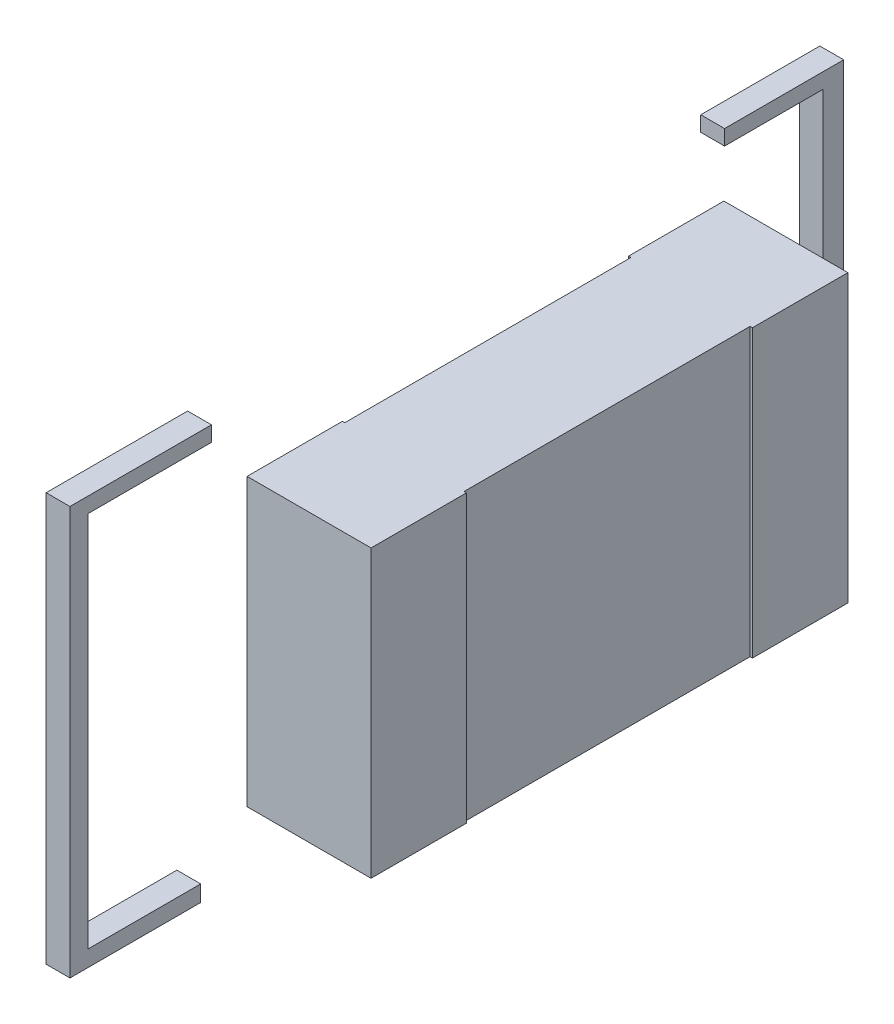
ISO-10303-21;
HEADER;
FILE_DESCRIPTION(('STEP AP214'),'2;1');
FILE_NAME('part.step','',(''),(''),'','','');
FILE_SCHEMA(('AUTOMOTIVE_DESIGN { 1 0 10303 214 1 1 1 1 }'));
ENDSEC;
DATA;
#1=APPLICATION_CONTEXT('core data for automotive mechanical design processes');
#2=APPLICATION_PROTOCOL_DEFINITION('international standard','automotive_design',2000,#1);
#3=PRODUCT_CONTEXT('',#1,'mechanical');
#4=PRODUCT('Part','Part','',(#3));
#5=PRODUCT_RELATED_PRODUCT_CATEGORY('part','',(#4));
#6=PRODUCT_DEFINITION_FORMATION('','',#4);
#7=PRODUCT_DEFINITION_CONTEXT('part definition',#1,'design');
#8=PRODUCT_DEFINITION('design','',#6,#7);
#9=PRODUCT_DEFINITION_SHAPE('','',#8);
#10=(LENGTH_UNIT() NAMED_UNIT(*) SI_UNIT(.MILLI.,.METRE.));
#11=(NAMED_UNIT(*) PLANE_ANGLE_UNIT() SI_UNIT($,.RADIAN.));
#12=(NAMED_UNIT(*) SI_UNIT($,.STERADIAN.) SOLID_ANGLE_UNIT());
#13=UNCERTAINTY_MEASURE_WITH_UNIT(LENGTH_MEASURE(1.E-05),#10,'distance_accuracy_value','');
#14=(GEOMETRIC_REPRESENTATION_CONTEXT(3) GLOBAL_UNCERTAINTY_ASSIGNED_CONTEXT((#13)) GLOBAL_UNIT_ASSIGNED_CONTEXT((#10,
#11,#12)) REPRESENTATION_CONTEXT('',''));
#15=CARTESIAN_POINT('',(0.,0.,0.));
#16=DIRECTION('',(0.,0.,1.));
#17=DIRECTION('',(1.,0.,0.));
#18=AXIS2_PLACEMENT_3D('',#15,#16,#17);
#19=CARTESIAN_POINT('',(-0.11,-1.45076015968424,0.594444727503703));
#20=DIRECTION('',(0.,1.,0.));
#21=DIRECTION('',(-1.,0.,0.));
#22=AXIS2_PLACEMENT_3D('',#19,#20,#21);
#23=PLANE('',#22);
#24=DIRECTION('',(0.,0.,1.));
#25=VECTOR('',#24,1.);
#26=CARTESIAN_POINT('',(-0.00999999999999985,-1.45076015968424,0.594444727503703));
#27=LINE('',#26,#25);
#28=CARTESIAN_POINT('',(-0.00999999999999985,-1.45076015968424,0.594444727503703));
#29=VERTEX_POINT('',#28);
#30=CARTESIAN_POINT('',(-0.00999999999999985,-1.45076015968424,1.14283758981673));
#31=VERTEX_POINT('',#30);
#32=EDGE_CURVE('E144',#29,#31,#27,.T.);
#33=ORIENTED_EDGE('',*,*,#32,.T.);
#34=DIRECTION('',(1.,0.,0.));
#35=VECTOR('',#34,1.);
#36=CARTESIAN_POINT('',(-0.11,-1.45076015968424,1.14283758981673));
#37=LINE('',#36,#35);
#38=CARTESIAN_POINT('',(-0.11,-1.45076015968424,1.14283758981673));
#39=VERTEX_POINT('',#38);
#40=EDGE_CURVE('E12',#39,#31,#37,.T.);
#41=ORIENTED_EDGE('',*,*,#40,.F.);
#42=DIRECTION('',(0.,0.,1.));
#43=VECTOR('',#42,1.);
#44=CARTESIAN_POINT('',(-0.11,-1.45076015968424,0.594444727503703));
#45=LINE('',#44,#43);
#46=CARTESIAN_POINT('',(-0.11,-1.45076015968424,0.594444727503703));
#47=VERTEX_POINT('',#46);
#48=EDGE_CURVE('E158',#47,#39,#45,.T.);
#49=ORIENTED_EDGE('',*,*,#48,.F.);
#50=DIRECTION('',(1.,0.,0.));
#51=VECTOR('',#50,1.);
#52=CARTESIAN_POINT('',(-0.11,-1.45076015968424,0.594444727503703));
#53=LINE('',#52,#51);
#54=EDGE_CURVE('E140',#47,#29,#53,.T.);
#55=ORIENTED_EDGE('',*,*,#54,.T.);
#56=EDGE_LOOP('',(#33,#41,#49,#55));
#57=FACE_BOUND('',#56,.T.);
#58=ADVANCED_FACE('F48',(#57),#23,.F.);
#59=CARTESIAN_POINT('',(-0.11,0.262028506170128,1.14283758981673));
#60=DIRECTION('',(0.,0.,-1.));
#61=DIRECTION('',(-1.,0.,0.));
#62=AXIS2_PLACEMENT_3D('',#59,#60,#61);
#63=PLANE('',#62);
#64=DIRECTION('',(0.,1.,0.));
#65=VECTOR('',#64,1.);
#66=CARTESIAN_POINT('',(-0.0100000000000001,0.262028506170128,1.14283758981673));
#67=LINE('',#66,#65);
#68=CARTESIAN_POINT('',(-0.0100000000000001,0.262028506170128,1.14283758981673));
#69=VERTEX_POINT('',#68);
#70=EDGE_CURVE('E147',#31,#69,#67,.T.);
#71=ORIENTED_EDGE('',*,*,#70,.T.);
#72=DIRECTION('',(1.,0.,0.));
#73=VECTOR('',#72,1.);
#74=CARTESIAN_POINT('',(-0.11,0.262028506170128,1.14283758981673));
#75=LINE('',#74,#73);
#76=CARTESIAN_POINT('',(-0.11,0.262028506170128,1.14283758981673));
#77=VERTEX_POINT('',#76);
#78=EDGE_CURVE('E56',#77,#69,#75,.T.);
#79=ORIENTED_EDGE('',*,*,#78,.F.);
#80=DIRECTION('',(0.,1.,0.));
#81=VECTOR('',#80,1.);
#82=CARTESIAN_POINT('',(-0.11,0.262028506170128,1.14283758981673));
#83=LINE('',#82,#81);
#84=EDGE_CURVE('E107',#39,#77,#83,.T.);
#85=ORIENTED_EDGE('',*,*,#84,.F.);
#86=ORIENTED_EDGE('',*,*,#40,.T.);
#87=EDGE_LOOP('',(#71,#79,#85,#86));
#88=FACE_BOUND('',#87,.T.);
#89=ADVANCED_FACE('F193',(#88),#63,.F.);
#90=CARTESIAN_POINT('',(-0.11,0.262028506170128,0.549371341560168));
#91=DIRECTION('',(0.,-1.,0.));
#92=DIRECTION('',(1.,0.,0.));
#93=AXIS2_PLACEMENT_3D('',#90,#91,#92);
#94=PLANE('',#93);
#95=DIRECTION('',(0.,0.,-1.));
#96=VECTOR('',#95,1.);
#97=CARTESIAN_POINT('',(-0.0100000000000001,0.262028506170128,0.549371341560168));
#98=LINE('',#97,#96);
#99=CARTESIAN_POINT('',(-0.0100000000000001,0.262028506170128,0.549371341560168));
#100=VERTEX_POINT('',#99);
#101=EDGE_CURVE('E149',#69,#100,#98,.T.);
#102=ORIENTED_EDGE('',*,*,#101,.T.);
#103=DIRECTION('',(1.,0.,0.));
#104=VECTOR('',#103,1.);
#105=CARTESIAN_POINT('',(-0.11,0.262028506170128,0.549371341560168));
#106=LINE('',#105,#104);
#107=CARTESIAN_POINT('',(-0.11,0.262028506170128,0.549371341560168));
#108=VERTEX_POINT('',#107);
#109=EDGE_CURVE('E165',#108,#100,#106,.T.);
#110=ORIENTED_EDGE('',*,*,#109,.F.);
#111=DIRECTION('',(0.,0.,-1.));
#112=VECTOR('',#111,1.);
#113=CARTESIAN_POINT('',(-0.11,0.262028506170128,0.549371341560168));
#114=LINE('',#113,#112);
#115=EDGE_CURVE('E173',#77,#108,#114,.T.);
#116=ORIENTED_EDGE('',*,*,#115,.F.);
#117=ORIENTED_EDGE('',*,*,#78,.T.);
#118=EDGE_LOOP('',(#102,#110,#116,#117));
#119=FACE_BOUND('',#118,.T.);
#120=ADVANCED_FACE('F171',(#119),#94,.F.);
#121=CARTESIAN_POINT('',(-0.11,0.262028506170128,0.549371341560168));
#122=DIRECTION('',(0.,0.,1.));
#123=DIRECTION('',(0.,-1.,0.));
#124=AXIS2_PLACEMENT_3D('',#121,#122,#123);
#125=PLANE('',#124);
#126=DIRECTION('',(0.,-1.,0.));
#127=VECTOR('',#126,1.);
#128=CARTESIAN_POINT('',(-0.0100000000000001,0.262028506170128,0.549371341560168));
#129=LINE('',#128,#127);
#130=CARTESIAN_POINT('',(-0.0100000000000001,0.198174542750119,0.549371341560168));
#131=VERTEX_POINT('',#130);
#132=EDGE_CURVE('E151',#100,#131,#129,.T.);
#133=ORIENTED_EDGE('',*,*,#132,.T.);
#134=DIRECTION('',(1.,0.,0.));
#135=VECTOR('',#134,1.);
#136=CARTESIAN_POINT('',(-0.11,0.198174542750119,0.549371341560168));
#137=LINE('',#136,#135);
#138=CARTESIAN_POINT('',(-0.11,0.198174542750119,0.549371341560168));
#139=VERTEX_POINT('',#138);
#140=EDGE_CURVE('E162',#139,#131,#137,.T.);
#141=ORIENTED_EDGE('',*,*,#140,.F.);
#142=DIRECTION('',(0.,-1.,0.));
#143=VECTOR('',#142,1.);
#144=CARTESIAN_POINT('',(-0.11,0.262028506170128,0.549371341560168));
#145=LINE('',#144,#143);
#146=EDGE_CURVE('E185',#108,#139,#145,.T.);
#147=ORIENTED_EDGE('',*,*,#146,.F.);
#148=ORIENTED_EDGE('',*,*,#109,.T.);
#149=EDGE_LOOP('',(#133,#141,#147,#148));
#150=FACE_BOUND('',#149,.T.);
#151=ADVANCED_FACE('F181',(#150),#125,.F.);
#152=CARTESIAN_POINT('',(-0.11,0.198174542750119,0.549371341560168));
#153=DIRECTION('',(0.,1.,0.));
#154=DIRECTION('',(-1.,0.,0.));
#155=AXIS2_PLACEMENT_3D('',#152,#153,#154);
#156=PLANE('',#155);
#157=DIRECTION('',(0.,0.,1.));
#158=VECTOR('',#157,1.);
#159=CARTESIAN_POINT('',(-0.0100000000000001,0.198174542750119,0.549371341560168));
#160=LINE('',#159,#158);
#161=CARTESIAN_POINT('',(-0.0100000000000001,0.198174542750119,1.06771527991083));
#162=VERTEX_POINT('',#161);
#163=EDGE_CURVE('E153',#131,#162,#160,.T.);
#164=ORIENTED_EDGE('',*,*,#163,.T.);
#165=DIRECTION('',(1.,0.,0.));
#166=VECTOR('',#165,1.);
#167=CARTESIAN_POINT('',(-0.11,0.198174542750119,1.06771527991083));
#168=LINE('',#167,#166);
#169=CARTESIAN_POINT('',(-0.11,0.198174542750119,1.06771527991083));
#170=VERTEX_POINT('',#169);
#171=EDGE_CURVE('E135',#170,#162,#168,.T.);
#172=ORIENTED_EDGE('',*,*,#171,.F.);
#173=DIRECTION('',(0.,0.,1.));
#174=VECTOR('',#173,1.);
#175=CARTESIAN_POINT('',(-0.11,0.198174542750119,0.549371341560168));
#176=LINE('',#175,#174);
#177=EDGE_CURVE('E126',#139,#170,#176,.T.);
#178=ORIENTED_EDGE('',*,*,#177,.F.);
#179=ORIENTED_EDGE('',*,*,#140,.T.);
#180=EDGE_LOOP('',(#164,#172,#178,#179));
#181=FACE_BOUND('',#180,.T.);
#182=ADVANCED_FACE('F184',(#181),#156,.F.);
#183=CARTESIAN_POINT('',(-0.11,0.198174542750119,1.06771527991083));
#184=DIRECTION('',(0.,0.,1.));
#185=DIRECTION('',(1.,0.,0.));
#186=AXIS2_PLACEMENT_3D('',#183,#184,#185);
#187=PLANE('',#186);
#188=DIRECTION('',(0.,-1.,0.));
#189=VECTOR('',#188,1.);
#190=CARTESIAN_POINT('',(-0.0100000000000001,0.198174542750119,1.06771527991083));
#191=LINE('',#190,#189);
#192=CARTESIAN_POINT('',(-0.00999999999999986,-1.38315008076894,1.06771527991083));
#193=VERTEX_POINT('',#192);
#194=EDGE_CURVE('E134',#162,#193,#191,.T.);
#195=ORIENTED_EDGE('',*,*,#194,.T.);
#196=DIRECTION('',(1.,0.,0.));
#197=VECTOR('',#196,1.);
#198=CARTESIAN_POINT('',(-0.11,-1.38315008076894,1.06771527991083));
#199=LINE('',#198,#197);
#200=CARTESIAN_POINT('',(-0.11,-1.38315008076894,1.06771527991083));
#201=VERTEX_POINT('',#200);
#202=EDGE_CURVE('E131',#201,#193,#199,.T.);
#203=ORIENTED_EDGE('',*,*,#202,.F.);
#204=DIRECTION('',(0.,-1.,0.));
#205=VECTOR('',#204,1.);
#206=CARTESIAN_POINT('',(-0.11,0.198174542750119,1.06771527991083));
#207=LINE('',#206,#205);
#208=EDGE_CURVE('E120',#170,#201,#207,.T.);
#209=ORIENTED_EDGE('',*,*,#208,.F.);
#210=ORIENTED_EDGE('',*,*,#171,.T.);
#211=EDGE_LOOP('',(#195,#203,#209,#210));
#212=FACE_BOUND('',#211,.T.);
#213=ADVANCED_FACE('F132',(#212),#187,.F.);
#214=CARTESIAN_POINT('',(-0.11,-1.38315008076894,0.594444727503703));
#215=DIRECTION('',(0.,-1.,0.));
#216=DIRECTION('',(1.,0.,0.));
#217=AXIS2_PLACEMENT_3D('',#214,#215,#216);
#218=PLANE('',#217);
#219=DIRECTION('',(0.,0.,-1.));
#220=VECTOR('',#219,1.);
#221=CARTESIAN_POINT('',(-0.00999999999999986,-1.38315008076894,0.594444727503703));
#222=LINE('',#221,#220);
#223=CARTESIAN_POINT('',(-0.00999999999999986,-1.38315008076894,0.594444727503703));
#224=VERTEX_POINT('',#223);
#225=EDGE_CURVE('E93',#193,#224,#222,.T.);
#226=ORIENTED_EDGE('',*,*,#225,.T.);
#227=DIRECTION('',(1.,0.,0.));
#228=VECTOR('',#227,1.);
#229=CARTESIAN_POINT('',(-0.11,-1.38315008076894,0.594444727503703));
#230=LINE('',#229,#228);
#231=CARTESIAN_POINT('',(-0.11,-1.38315008076894,0.594444727503703));
#232=VERTEX_POINT('',#231);
#233=EDGE_CURVE('E136',#232,#224,#230,.T.);
#234=ORIENTED_EDGE('',*,*,#233,.F.);
#235=DIRECTION('',(0.,0.,-1.));
#236=VECTOR('',#235,1.);
#237=CARTESIAN_POINT('',(-0.11,-1.38315008076894,0.594444727503703));
#238=LINE('',#237,#236);
#239=EDGE_CURVE('E124',#201,#232,#238,.T.);
#240=ORIENTED_EDGE('',*,*,#239,.F.);
#241=ORIENTED_EDGE('',*,*,#202,.T.);
#242=EDGE_LOOP('',(#226,#234,#240,#241));
#243=FACE_BOUND('',#242,.T.);
#244=ADVANCED_FACE('F138',(#243),#218,.F.);
#245=CARTESIAN_POINT('',(-0.11,-1.38315008076894,0.594444727503703));
#246=DIRECTION('',(0.,0.,1.));
#247=DIRECTION('',(1.,0.,0.));
#248=AXIS2_PLACEMENT_3D('',#245,#246,#247);
#249=PLANE('',#248);
#250=DIRECTION('',(0.,-1.,0.));
#251=VECTOR('',#250,1.);
#252=CARTESIAN_POINT('',(-0.00999999999999986,-1.38315008076894,0.594444727503703));
#253=LINE('',#252,#251);
#254=EDGE_CURVE('E99',#224,#29,#253,.T.);
#255=ORIENTED_EDGE('',*,*,#254,.T.);
#256=ORIENTED_EDGE('',*,*,#54,.F.);
#257=DIRECTION('',(0.,-1.,0.));
#258=VECTOR('',#257,1.);
#259=CARTESIAN_POINT('',(-0.11,-1.38315008076894,0.594444727503703));
#260=LINE('',#259,#258);
#261=EDGE_CURVE('E64',#232,#47,#260,.T.);
#262=ORIENTED_EDGE('',*,*,#261,.F.);
#263=ORIENTED_EDGE('',*,*,#233,.T.);
#264=EDGE_LOOP('',(#255,#256,#262,#263));
#265=FACE_BOUND('',#264,.T.);
#266=ADVANCED_FACE('F209',(#265),#249,.F.);
#267=CARTESIAN_POINT('',(-0.11,0.,0.));
#268=DIRECTION('',(1.,0.,0.));
#269=DIRECTION('',(0.,1.,0.));
#270=AXIS2_PLACEMENT_3D('',#267,#268,#269);
#271=PLANE('',#270);
#272=ORIENTED_EDGE('',*,*,#48,.T.);
#273=ORIENTED_EDGE('',*,*,#84,.T.);
#274=ORIENTED_EDGE('',*,*,#115,.T.);
#275=ORIENTED_EDGE('',*,*,#146,.T.);
#276=ORIENTED_EDGE('',*,*,#177,.T.);
#277=ORIENTED_EDGE('',*,*,#208,.T.);
#278=ORIENTED_EDGE('',*,*,#239,.T.);
#279=ORIENTED_EDGE('',*,*,#261,.T.);
#280=EDGE_LOOP('',(#272,#273,#274,#275,#276,#277,#278,#279));
#281=FACE_BOUND('',#280,.T.);
#282=ADVANCED_FACE('F122',(#281),#271,.F.);
#283=CARTESIAN_POINT('',(-0.01,0.,0.));
#284=DIRECTION('',(1.,0.,0.));
#285=DIRECTION('',(0.,1.,0.));
#286=AXIS2_PLACEMENT_3D('',#283,#284,#285);
#287=PLANE('',#286);
#288=ORIENTED_EDGE('',*,*,#32,.F.);
#289=ORIENTED_EDGE('',*,*,#254,.F.);
#290=ORIENTED_EDGE('',*,*,#225,.F.);
#291=ORIENTED_EDGE('',*,*,#194,.F.);
#292=ORIENTED_EDGE('',*,*,#163,.F.);
#293=ORIENTED_EDGE('',*,*,#132,.F.);
#294=ORIENTED_EDGE('',*,*,#101,.F.);
#295=ORIENTED_EDGE('',*,*,#70,.F.);
#296=EDGE_LOOP('',(#288,#289,#290,#291,#292,#293,#294,#295));
#297=FACE_BOUND('',#296,.T.);
#298=ADVANCED_FACE('F177',(#297),#287,.T.);
#299=CLOSED_SHELL('',(#58,#89,#120,#151,#182,#213,#244,#266,#282,#298));
#300=MANIFOLD_SOLID_BREP('B2',#299);
#301=CARTESIAN_POINT('',(-0.11,0.262028506170128,-2.10244619811787));
#302=DIRECTION('',(0.,0.,1.));
#303=DIRECTION('',(1.,0.,0.));
#304=AXIS2_PLACEMENT_3D('',#301,#302,#303);
#305=PLANE('',#304);
#306=DIRECTION('',(0.,-1.,0.));
#307=VECTOR('',#306,1.);
#308=CARTESIAN_POINT('',(-0.0100000000000001,0.262028506170128,-2.10244619811787));
#309=LINE('',#308,#307);
#310=CARTESIAN_POINT('',(-0.0100000000000001,0.262028506170128,-2.10244619811787));
#311=VERTEX_POINT('',#310);
#312=CARTESIAN_POINT('',(-0.00999999999999985,-1.45076015968424,-2.10244619811787));
#313=VERTEX_POINT('',#312);
#314=EDGE_CURVE('E381',#311,#313,#309,.T.);
#315=ORIENTED_EDGE('',*,*,#314,.T.);
#316=DIRECTION('',(1.,0.,0.));
#317=VECTOR('',#316,1.);
#318=CARTESIAN_POINT('',(-0.11,-1.45076015968424,-2.10244619811787));
#319=LINE('',#318,#317);
#320=CARTESIAN_POINT('',(-0.11,-1.45076015968424,-2.10244619811787));
#321=VERTEX_POINT('',#320);
#322=EDGE_CURVE('E46',#321,#313,#319,.T.);
#323=ORIENTED_EDGE('',*,*,#322,.F.);
#324=DIRECTION('',(0.,-1.,0.));
#325=VECTOR('',#324,1.);
#326=CARTESIAN_POINT('',(-0.11,0.262028506170128,-2.10244619811787));
#327=LINE('',#326,#325);
#328=CARTESIAN_POINT('',(-0.11,0.262028506170128,-2.10244619811787));
#329=VERTEX_POINT('',#328);
#330=EDGE_CURVE('E395',#329,#321,#327,.T.);
#331=ORIENTED_EDGE('',*,*,#330,.F.);
#332=DIRECTION('',(1.,0.,0.));
#333=VECTOR('',#332,1.);
#334=CARTESIAN_POINT('',(-0.11,0.262028506170128,-2.10244619811787));
#335=LINE('',#334,#333);
#336=EDGE_CURVE('E377',#329,#311,#335,.T.);
#337=ORIENTED_EDGE('',*,*,#336,.T.);
#338=EDGE_LOOP('',(#315,#323,#331,#337));
#339=FACE_BOUND('',#338,.T.);
#340=ADVANCED_FACE('F285',(#339),#305,.F.);
#341=CARTESIAN_POINT('',(-0.11,-1.45076015968424,-2.10244619811787));
#342=DIRECTION('',(0.,1.,0.));
#343=DIRECTION('',(-1.,0.,0.));
#344=AXIS2_PLACEMENT_3D('',#341,#342,#343);
#345=PLANE('',#344);
#346=DIRECTION('',(0.,0.,1.));
#347=VECTOR('',#346,1.);
#348=CARTESIAN_POINT('',(-0.00999999999999985,-1.45076015968424,-2.10244619811787));
#349=LINE('',#348,#347);
#350=CARTESIAN_POINT('',(-0.00999999999999985,-1.45076015968424,-1.60288283724368));
#351=VERTEX_POINT('',#350);
#352=EDGE_CURVE('E384',#313,#351,#349,.T.);
#353=ORIENTED_EDGE('',*,*,#352,.T.);
#354=DIRECTION('',(1.,0.,0.));
#355=VECTOR('',#354,1.);
#356=CARTESIAN_POINT('',(-0.11,-1.45076015968424,-1.60288283724368));
#357=LINE('',#356,#355);
#358=CARTESIAN_POINT('',(-0.11,-1.45076015968424,-1.60288283724368));
#359=VERTEX_POINT('',#358);
#360=EDGE_CURVE('E293',#359,#351,#357,.T.);
#361=ORIENTED_EDGE('',*,*,#360,.F.);
#362=DIRECTION('',(0.,0.,1.));
#363=VECTOR('',#362,1.);
#364=CARTESIAN_POINT('',(-0.11,-1.45076015968424,-2.10244619811787));
#365=LINE('',#364,#363);
#366=EDGE_CURVE('E344',#321,#359,#365,.T.);
#367=ORIENTED_EDGE('',*,*,#366,.F.);
#368=ORIENTED_EDGE('',*,*,#322,.T.);
#369=EDGE_LOOP('',(#353,#361,#367,#368));
#370=FACE_BOUND('',#369,.T.);
#371=ADVANCED_FACE('F430',(#370),#345,.F.);
#372=CARTESIAN_POINT('',(-0.11,-1.38315008076894,-1.60288283724368));
#373=DIRECTION('',(0.,0.,-1.));
#374=DIRECTION('',(-1.,0.,0.));
#375=AXIS2_PLACEMENT_3D('',#372,#373,#374);
#376=PLANE('',#375);
#377=DIRECTION('',(0.,1.,0.));
#378=VECTOR('',#377,1.);
#379=CARTESIAN_POINT('',(-0.00999999999999986,-1.38315008076894,-1.60288283724368));
#380=LINE('',#379,#378);
#381=CARTESIAN_POINT('',(-0.00999999999999986,-1.38315008076894,-1.60288283724368));
#382=VERTEX_POINT('',#381);
#383=EDGE_CURVE('E386',#351,#382,#380,.T.);
#384=ORIENTED_EDGE('',*,*,#383,.T.);
#385=DIRECTION('',(1.,0.,0.));
#386=VECTOR('',#385,1.);
#387=CARTESIAN_POINT('',(-0.11,-1.38315008076894,-1.60288283724368));
#388=LINE('',#387,#386);
#389=CARTESIAN_POINT('',(-0.11,-1.38315008076894,-1.60288283724368));
#390=VERTEX_POINT('',#389);
#391=EDGE_CURVE('E402',#390,#382,#388,.T.);
#392=ORIENTED_EDGE('',*,*,#391,.F.);
#393=DIRECTION('',(0.,1.,0.));
#394=VECTOR('',#393,1.);
#395=CARTESIAN_POINT('',(-0.11,-1.38315008076894,-1.60288283724368));
#396=LINE('',#395,#394);
#397=EDGE_CURVE('E410',#359,#390,#396,.T.);
#398=ORIENTED_EDGE('',*,*,#397,.F.);
#399=ORIENTED_EDGE('',*,*,#360,.T.);
#400=EDGE_LOOP('',(#384,#392,#398,#399));
#401=FACE_BOUND('',#400,.T.);
#402=ADVANCED_FACE('F408',(#401),#376,.F.);
#403=CARTESIAN_POINT('',(-0.11,-1.38315008076894,-2.01605554172609));
#404=DIRECTION('',(0.,-1.,0.));
#405=DIRECTION('',(0.,0.,-1.));
#406=AXIS2_PLACEMENT_3D('',#403,#404,#405);
#407=PLANE('',#406);
#408=DIRECTION('',(0.,0.,-1.));
#409=VECTOR('',#408,1.);
#410=CARTESIAN_POINT('',(-0.00999999999999986,-1.38315008076894,-2.01605554172609));
#411=LINE('',#410,#409);
#412=CARTESIAN_POINT('',(-0.00999999999999986,-1.38315008076894,-2.01605554172609));
#413=VERTEX_POINT('',#412);
#414=EDGE_CURVE('E388',#382,#413,#411,.T.);
#415=ORIENTED_EDGE('',*,*,#414,.T.);
#416=DIRECTION('',(1.,0.,0.));
#417=VECTOR('',#416,1.);
#418=CARTESIAN_POINT('',(-0.11,-1.38315008076894,-2.01605554172609));
#419=LINE('',#418,#417);
#420=CARTESIAN_POINT('',(-0.11,-1.38315008076894,-2.01605554172609));
#421=VERTEX_POINT('',#420);
#422=EDGE_CURVE('E399',#421,#413,#419,.T.);
#423=ORIENTED_EDGE('',*,*,#422,.F.);
#424=DIRECTION('',(0.,0.,-1.));
#425=VECTOR('',#424,1.);
#426=CARTESIAN_POINT('',(-0.11,-1.38315008076894,-2.01605554172609));
#427=LINE('',#426,#425);
#428=EDGE_CURVE('E422',#390,#421,#427,.T.);
#429=ORIENTED_EDGE('',*,*,#428,.F.);
#430=ORIENTED_EDGE('',*,*,#391,.T.);
#431=EDGE_LOOP('',(#415,#423,#429,#430));
#432=FACE_BOUND('',#431,.T.);
#433=ADVANCED_FACE('F418',(#432),#407,.F.);
#434=CARTESIAN_POINT('',(-0.11,0.198174542750119,-2.01605554172609));
#435=DIRECTION('',(0.,0.,-1.));
#436=DIRECTION('',(-1.,0.,0.));
#437=AXIS2_PLACEMENT_3D('',#434,#435,#436);
#438=PLANE('',#437);
#439=DIRECTION('',(0.,1.,0.));
#440=VECTOR('',#439,1.);
#441=CARTESIAN_POINT('',(-0.0100000000000001,0.198174542750119,-2.01605554172609));
#442=LINE('',#441,#440);
#443=CARTESIAN_POINT('',(-0.0100000000000001,0.198174542750119,-2.01605554172609));
#444=VERTEX_POINT('',#443);
#445=EDGE_CURVE('E390',#413,#444,#442,.T.);
#446=ORIENTED_EDGE('',*,*,#445,.T.);
#447=DIRECTION('',(1.,0.,0.));
#448=VECTOR('',#447,1.);
#449=CARTESIAN_POINT('',(-0.11,0.198174542750119,-2.01605554172609));
#450=LINE('',#449,#448);
#451=CARTESIAN_POINT('',(-0.11,0.198174542750119,-2.01605554172609));
#452=VERTEX_POINT('',#451);
#453=EDGE_CURVE('E372',#452,#444,#450,.T.);
#454=ORIENTED_EDGE('',*,*,#453,.F.);
#455=DIRECTION('',(0.,1.,0.));
#456=VECTOR('',#455,1.);
#457=CARTESIAN_POINT('',(-0.11,0.198174542750119,-2.01605554172609));
#458=LINE('',#457,#456);
#459=EDGE_CURVE('E363',#421,#452,#458,.T.);
#460=ORIENTED_EDGE('',*,*,#459,.F.);
#461=ORIENTED_EDGE('',*,*,#422,.T.);
#462=EDGE_LOOP('',(#446,#454,#460,#461));
#463=FACE_BOUND('',#462,.T.);
#464=ADVANCED_FACE('F421',(#463),#438,.F.);
#465=CARTESIAN_POINT('',(-0.11,0.198174542750119,-2.01605554172609));
#466=DIRECTION('',(0.,1.,0.));
#467=DIRECTION('',(-1.,0.,0.));
#468=AXIS2_PLACEMENT_3D('',#465,#466,#467);
#469=PLANE('',#468);
#470=DIRECTION('',(0.,0.,1.));
#471=VECTOR('',#470,1.);
#472=CARTESIAN_POINT('',(-0.0100000000000001,0.198174542750119,-2.01605554172609));
#473=LINE('',#472,#471);
#474=CARTESIAN_POINT('',(-0.0100000000000001,0.198174542750119,-1.60288283724368));
#475=VERTEX_POINT('',#474);
#476=EDGE_CURVE('E371',#444,#475,#473,.T.);
#477=ORIENTED_EDGE('',*,*,#476,.T.);
#478=DIRECTION('',(1.,0.,0.));
#479=VECTOR('',#478,1.);
#480=CARTESIAN_POINT('',(-0.11,0.198174542750119,-1.60288283724368));
#481=LINE('',#480,#479);
#482=CARTESIAN_POINT('',(-0.11,0.198174542750119,-1.60288283724368));
#483=VERTEX_POINT('',#482);
#484=EDGE_CURVE('E368',#483,#475,#481,.T.);
#485=ORIENTED_EDGE('',*,*,#484,.F.);
#486=DIRECTION('',(0.,0.,1.));
#487=VECTOR('',#486,1.);
#488=CARTESIAN_POINT('',(-0.11,0.198174542750119,-2.01605554172609));
#489=LINE('',#488,#487);
#490=EDGE_CURVE('E357',#452,#483,#489,.T.);
#491=ORIENTED_EDGE('',*,*,#490,.F.);
#492=ORIENTED_EDGE('',*,*,#453,.T.);
#493=EDGE_LOOP('',(#477,#485,#491,#492));
#494=FACE_BOUND('',#493,.T.);
#495=ADVANCED_FACE('F369',(#494),#469,.F.);
#496=CARTESIAN_POINT('',(-0.11,0.262028506170128,-1.60288283724368));
#497=DIRECTION('',(0.,0.,-1.));
#498=DIRECTION('',(0.,1.,0.));
#499=AXIS2_PLACEMENT_3D('',#496,#497,#498);
#500=PLANE('',#499);
#501=DIRECTION('',(0.,1.,0.));
#502=VECTOR('',#501,1.);
#503=CARTESIAN_POINT('',(-0.0100000000000001,0.262028506170128,-1.60288283724368));
#504=LINE('',#503,#502);
#505=CARTESIAN_POINT('',(-0.0100000000000001,0.262028506170128,-1.60288283724368));
#506=VERTEX_POINT('',#505);
#507=EDGE_CURVE('E330',#475,#506,#504,.T.);
#508=ORIENTED_EDGE('',*,*,#507,.T.);
#509=DIRECTION('',(1.,0.,0.));
#510=VECTOR('',#509,1.);
#511=CARTESIAN_POINT('',(-0.11,0.262028506170128,-1.60288283724368));
#512=LINE('',#511,#510);
#513=CARTESIAN_POINT('',(-0.11,0.262028506170128,-1.60288283724368));
#514=VERTEX_POINT('',#513);
#515=EDGE_CURVE('E373',#514,#506,#512,.T.);
#516=ORIENTED_EDGE('',*,*,#515,.F.);
#517=DIRECTION('',(0.,1.,0.));
#518=VECTOR('',#517,1.);
#519=CARTESIAN_POINT('',(-0.11,0.262028506170128,-1.60288283724368));
#520=LINE('',#519,#518);
#521=EDGE_CURVE('E361',#483,#514,#520,.T.);
#522=ORIENTED_EDGE('',*,*,#521,.F.);
#523=ORIENTED_EDGE('',*,*,#484,.T.);
#524=EDGE_LOOP('',(#508,#516,#522,#523));
#525=FACE_BOUND('',#524,.T.);
#526=ADVANCED_FACE('F375',(#525),#500,.F.);
#527=CARTESIAN_POINT('',(-0.11,0.262028506170128,-2.10244619811787));
#528=DIRECTION('',(0.,-1.,0.));
#529=DIRECTION('',(1.,0.,0.));
#530=AXIS2_PLACEMENT_3D('',#527,#528,#529);
#531=PLANE('',#530);
#532=DIRECTION('',(0.,0.,-1.));
#533=VECTOR('',#532,1.);
#534=CARTESIAN_POINT('',(-0.0100000000000001,0.262028506170128,-2.10244619811787));
#535=LINE('',#534,#533);
#536=EDGE_CURVE('E336',#506,#311,#535,.T.);
#537=ORIENTED_EDGE('',*,*,#536,.T.);
#538=ORIENTED_EDGE('',*,*,#336,.F.);
#539=DIRECTION('',(0.,0.,-1.));
#540=VECTOR('',#539,1.);
#541=CARTESIAN_POINT('',(-0.11,0.262028506170128,-2.10244619811787));
#542=LINE('',#541,#540);
#543=EDGE_CURVE('E301',#514,#329,#542,.T.);
#544=ORIENTED_EDGE('',*,*,#543,.F.);
#545=ORIENTED_EDGE('',*,*,#515,.T.);
#546=EDGE_LOOP('',(#537,#538,#544,#545));
#547=FACE_BOUND('',#546,.T.);
#548=ADVANCED_FACE('F446',(#547),#531,.F.);
#549=CARTESIAN_POINT('',(-0.11,0.,0.));
#550=DIRECTION('',(-1.,0.,0.));
#551=DIRECTION('',(0.,-1.,0.));
#552=AXIS2_PLACEMENT_3D('',#549,#550,#551);
#553=PLANE('',#552);
#554=ORIENTED_EDGE('',*,*,#330,.T.);
#555=ORIENTED_EDGE('',*,*,#366,.T.);
#556=ORIENTED_EDGE('',*,*,#397,.T.);
#557=ORIENTED_EDGE('',*,*,#428,.T.);
#558=ORIENTED_EDGE('',*,*,#459,.T.);
#559=ORIENTED_EDGE('',*,*,#490,.T.);
#560=ORIENTED_EDGE('',*,*,#521,.T.);
#561=ORIENTED_EDGE('',*,*,#543,.T.);
#562=EDGE_LOOP('',(#554,#555,#556,#557,#558,#559,#560,#561));
#563=FACE_BOUND('',#562,.T.);
#564=ADVANCED_FACE('F359',(#563),#553,.T.);
#565=CARTESIAN_POINT('',(-0.01,0.,0.));
#566=DIRECTION('',(-1.,0.,0.));
#567=DIRECTION('',(0.,-1.,0.));
#568=AXIS2_PLACEMENT_3D('',#565,#566,#567);
#569=PLANE('',#568);
#570=ORIENTED_EDGE('',*,*,#314,.F.);
#571=ORIENTED_EDGE('',*,*,#536,.F.);
#572=ORIENTED_EDGE('',*,*,#507,.F.);
#573=ORIENTED_EDGE('',*,*,#476,.F.);
#574=ORIENTED_EDGE('',*,*,#445,.F.);
#575=ORIENTED_EDGE('',*,*,#414,.F.);
#576=ORIENTED_EDGE('',*,*,#383,.F.);
#577=ORIENTED_EDGE('',*,*,#352,.F.);
#578=EDGE_LOOP('',(#570,#571,#572,#573,#574,#575,#576,#577));
#579=FACE_BOUND('',#578,.T.);
#580=ADVANCED_FACE('F414',(#579),#569,.F.);
#581=CLOSED_SHELL('',(#340,#371,#402,#433,#464,#495,#526,#548,#564,#580));
#582=MANIFOLD_SOLID_BREP('B6',#581);
#583=CARTESIAN_POINT('',(0.5,-1.2,0.));
#584=DIRECTION('',(0.,1.,0.));
#585=DIRECTION('',(0.,0.,1.));
#586=AXIS2_PLACEMENT_3D('',#583,#584,#585);
#587=PLANE('',#586);
#588=DIRECTION('',(0.,0.,-1.));
#589=VECTOR('',#588,1.);
#590=CARTESIAN_POINT('',(0.,-1.2,0.));
#591=LINE('',#590,#589);
#592=CARTESIAN_POINT('',(0.,-1.2,0.));
#593=VERTEX_POINT('',#592);
#594=CARTESIAN_POINT('',(0.,-1.2,-1.2));
#595=VERTEX_POINT('',#594);
#596=EDGE_CURVE('E682',#593,#595,#591,.T.);
#597=ORIENTED_EDGE('',*,*,#596,.T.);
#598=DIRECTION('',(1.,0.,0.));
#599=VECTOR('',#598,1.);
#600=CARTESIAN_POINT('',(-0.00999999999999988,-1.2,-1.2));
#601=LINE('',#600,#599);
#602=CARTESIAN_POINT('',(-0.00999999999999988,-1.2,-1.2));
#603=VERTEX_POINT('',#602);
#604=EDGE_CURVE('E626',#603,#595,#601,.T.);
#605=ORIENTED_EDGE('',*,*,#604,.F.);
#606=DIRECTION('',(0.,0.,1.));
#607=VECTOR('',#606,1.);
#608=CARTESIAN_POINT('',(-0.00999999999999988,-1.2,-1.6));
#609=LINE('',#608,#607);
#610=CARTESIAN_POINT('',(-0.00999999999999988,-1.2,-1.6));
#611=VERTEX_POINT('',#610);
#612=EDGE_CURVE('E635',#611,#603,#609,.T.);
#613=ORIENTED_EDGE('',*,*,#612,.F.);
#614=DIRECTION('',(1.,0.,0.));
#615=VECTOR('',#614,1.);
#616=CARTESIAN_POINT('',(-0.00999999999999988,-1.2,-1.6));
#617=LINE('',#616,#615);
#618=CARTESIAN_POINT('',(0.51,-1.2,-1.6));
#619=VERTEX_POINT('',#618);
#620=EDGE_CURVE('E625',#611,#619,#617,.T.);
#621=ORIENTED_EDGE('',*,*,#620,.T.);
#622=DIRECTION('',(0.,0.,1.));
#623=VECTOR('',#622,1.);
#624=CARTESIAN_POINT('',(0.51,-1.2,-1.6));
#625=LINE('',#624,#623);
#626=CARTESIAN_POINT('',(0.51,-1.2,-1.2));
#627=VERTEX_POINT('',#626);
#628=EDGE_CURVE('E653',#619,#627,#625,.T.);
#629=ORIENTED_EDGE('',*,*,#628,.T.);
#630=CARTESIAN_POINT('',(0.5,-1.2,-1.2));
#631=VERTEX_POINT('',#630);
#632=EDGE_CURVE('E647',#631,#627,#601,.T.);
#633=ORIENTED_EDGE('',*,*,#632,.F.);
#634=DIRECTION('',(0.,0.,-1.));
#635=VECTOR('',#634,1.);
#636=CARTESIAN_POINT('',(0.5,-1.2,0.));
#637=LINE('',#636,#635);
#638=CARTESIAN_POINT('',(0.5,-1.2,0.));
#639=VERTEX_POINT('',#638);
#640=EDGE_CURVE('E680',#639,#631,#637,.T.);
#641=ORIENTED_EDGE('',*,*,#640,.F.);
#642=DIRECTION('',(1.,0.,0.));
#643=VECTOR('',#642,1.);
#644=CARTESIAN_POINT('',(-0.00999999999999988,-1.2,0.));
#645=LINE('',#644,#643);
#646=CARTESIAN_POINT('',(0.51,-1.2,0.));
#647=VERTEX_POINT('',#646);
#648=EDGE_CURVE('E537',#639,#647,#645,.T.);
#649=ORIENTED_EDGE('',*,*,#648,.T.);
#650=DIRECTION('',(0.,0.,-1.));
#651=VECTOR('',#650,1.);
#652=CARTESIAN_POINT('',(0.51,-1.2,0.4));
#653=LINE('',#652,#651);
#654=CARTESIAN_POINT('',(0.51,-1.2,0.4));
#655=VERTEX_POINT('',#654);
#656=EDGE_CURVE('E725',#655,#647,#653,.T.);
#657=ORIENTED_EDGE('',*,*,#656,.F.);
#658=DIRECTION('',(1.,0.,0.));
#659=VECTOR('',#658,1.);
#660=CARTESIAN_POINT('',(-0.00999999999999988,-1.2,0.4));
#661=LINE('',#660,#659);
#662=CARTESIAN_POINT('',(-0.00999999999999988,-1.2,0.4));
#663=VERTEX_POINT('',#662);
#664=EDGE_CURVE('E742',#663,#655,#661,.T.);
#665=ORIENTED_EDGE('',*,*,#664,.F.);
#666=DIRECTION('',(0.,0.,-1.));
#667=VECTOR('',#666,1.);
#668=CARTESIAN_POINT('',(-0.00999999999999988,-1.2,0.4));
#669=LINE('',#668,#667);
#670=CARTESIAN_POINT('',(-0.00999999999999988,-1.2,0.));
#671=VERTEX_POINT('',#670);
#672=EDGE_CURVE('E690',#663,#671,#669,.T.);
#673=ORIENTED_EDGE('',*,*,#672,.T.);
#674=EDGE_CURVE('E704',#671,#593,#645,.T.);
#675=ORIENTED_EDGE('',*,*,#674,.T.);
#676=EDGE_LOOP('',(#597,#605,#613,#621,#629,#633,#641,#649,#657,#665,#673,#675));
#677=FACE_BOUND('',#676,.T.);
#678=ADVANCED_FACE('F512',(#677),#587,.F.);
#679=CARTESIAN_POINT('',(0.5,0.,0.));
#680=DIRECTION('',(0.,-1.,0.));
#681=DIRECTION('',(0.,0.,-1.));
#682=AXIS2_PLACEMENT_3D('',#679,#680,#681);
#683=PLANE('',#682);
#684=DIRECTION('',(0.,0.,1.));
#685=VECTOR('',#684,1.);
#686=CARTESIAN_POINT('',(0.,0.,0.));
#687=LINE('',#686,#685);
#688=CARTESIAN_POINT('',(0.,0.,-1.2));
#689=VERTEX_POINT('',#688);
#690=CARTESIAN_POINT('',(0.,0.,0.));
#691=VERTEX_POINT('',#690);
#692=EDGE_CURVE('E671',#689,#691,#687,.T.);
#693=ORIENTED_EDGE('',*,*,#692,.T.);
#694=DIRECTION('',(-1.,0.,0.));
#695=VECTOR('',#694,1.);
#696=CARTESIAN_POINT('',(-0.01,0.,0.));
#697=LINE('',#696,#695);
#698=CARTESIAN_POINT('',(-0.01,0.,0.));
#699=VERTEX_POINT('',#698);
#700=EDGE_CURVE('E713',#691,#699,#697,.T.);
#701=ORIENTED_EDGE('',*,*,#700,.T.);
#702=DIRECTION('',(0.,0.,-1.));
#703=VECTOR('',#702,1.);
#704=CARTESIAN_POINT('',(-0.01,0.,0.4));
#705=LINE('',#704,#703);
#706=CARTESIAN_POINT('',(-0.01,0.,0.4));
#707=VERTEX_POINT('',#706);
#708=EDGE_CURVE('E716',#707,#699,#705,.T.);
#709=ORIENTED_EDGE('',*,*,#708,.F.);
#710=DIRECTION('',(-1.,0.,0.));
#711=VECTOR('',#710,1.);
#712=CARTESIAN_POINT('',(-0.01,0.,0.4));
#713=LINE('',#712,#711);
#714=CARTESIAN_POINT('',(0.51,0.,0.4));
#715=VERTEX_POINT('',#714);
#716=EDGE_CURVE('E733',#715,#707,#713,.T.);
#717=ORIENTED_EDGE('',*,*,#716,.F.);
#718=DIRECTION('',(0.,0.,-1.));
#719=VECTOR('',#718,1.);
#720=CARTESIAN_POINT('',(0.51,0.,0.4));
#721=LINE('',#720,#719);
#722=CARTESIAN_POINT('',(0.51,0.,0.));
#723=VERTEX_POINT('',#722);
#724=EDGE_CURVE('E727',#715,#723,#721,.T.);
#725=ORIENTED_EDGE('',*,*,#724,.T.);
#726=CARTESIAN_POINT('',(0.5,0.,0.));
#727=VERTEX_POINT('',#726);
#728=EDGE_CURVE('E720',#723,#727,#697,.T.);
#729=ORIENTED_EDGE('',*,*,#728,.T.);
#730=DIRECTION('',(0.,0.,1.));
#731=VECTOR('',#730,1.);
#732=CARTESIAN_POINT('',(0.5,0.,0.));
#733=LINE('',#732,#731);
#734=CARTESIAN_POINT('',(0.5,0.,-1.2));
#735=VERTEX_POINT('',#734);
#736=EDGE_CURVE('E283',#735,#727,#733,.T.);
#737=ORIENTED_EDGE('',*,*,#736,.F.);
#738=DIRECTION('',(-1.,0.,0.));
#739=VECTOR('',#738,1.);
#740=CARTESIAN_POINT('',(-0.01,0.,-1.2));
#741=LINE('',#740,#739);
#742=CARTESIAN_POINT('',(0.51,0.,-1.2));
#743=VERTEX_POINT('',#742);
#744=EDGE_CURVE('E529',#743,#735,#741,.T.);
#745=ORIENTED_EDGE('',*,*,#744,.F.);
#746=DIRECTION('',(0.,0.,1.));
#747=VECTOR('',#746,1.);
#748=CARTESIAN_POINT('',(0.51,0.,-1.6));
#749=LINE('',#748,#747);
#750=CARTESIAN_POINT('',(0.51,0.,-1.6));
#751=VERTEX_POINT('',#750);
#752=EDGE_CURVE('E616',#751,#743,#749,.T.);
#753=ORIENTED_EDGE('',*,*,#752,.F.);
#754=DIRECTION('',(-1.,0.,0.));
#755=VECTOR('',#754,1.);
#756=CARTESIAN_POINT('',(-0.01,0.,-1.6));
#757=LINE('',#756,#755);
#758=CARTESIAN_POINT('',(-0.01,0.,-1.6));
#759=VERTEX_POINT('',#758);
#760=EDGE_CURVE('E622',#751,#759,#757,.T.);
#761=ORIENTED_EDGE('',*,*,#760,.T.);
#762=DIRECTION('',(0.,0.,1.));
#763=VECTOR('',#762,1.);
#764=CARTESIAN_POINT('',(-0.01,0.,-1.6));
#765=LINE('',#764,#763);
#766=CARTESIAN_POINT('',(-0.01,0.,-1.2));
#767=VERTEX_POINT('',#766);
#768=EDGE_CURVE('E605',#759,#767,#765,.T.);
#769=ORIENTED_EDGE('',*,*,#768,.T.);
#770=EDGE_CURVE('E637',#689,#767,#741,.T.);
#771=ORIENTED_EDGE('',*,*,#770,.F.);
#772=EDGE_LOOP('',(#693,#701,#709,#717,#725,#729,#737,#745,#753,#761,#769,#771));
#773=FACE_BOUND('',#772,.T.);
#774=ADVANCED_FACE('F629',(#773),#683,.F.);
#775=CARTESIAN_POINT('',(0.5,0.,0.));
#776=DIRECTION('',(1.,0.,0.));
#777=DIRECTION('',(0.,0.,-1.));
#778=AXIS2_PLACEMENT_3D('',#775,#776,#777);
#779=PLANE('',#778);
#780=DIRECTION('',(0.,-1.,0.));
#781=VECTOR('',#780,1.);
#782=CARTESIAN_POINT('',(0.5,0.,0.));
#783=LINE('',#782,#781);
#784=EDGE_CURVE('E677',#727,#639,#783,.T.);
#785=ORIENTED_EDGE('',*,*,#784,.T.);
#786=ORIENTED_EDGE('',*,*,#640,.T.);
#787=DIRECTION('',(0.,1.,0.));
#788=VECTOR('',#787,1.);
#789=CARTESIAN_POINT('',(0.5,0.,-1.2));
#790=LINE('',#789,#788);
#791=EDGE_CURVE('E521',#631,#735,#790,.T.);
#792=ORIENTED_EDGE('',*,*,#791,.T.);
#793=ORIENTED_EDGE('',*,*,#736,.T.);
#794=EDGE_LOOP('',(#785,#786,#792,#793));
#795=FACE_BOUND('',#794,.T.);
#796=ADVANCED_FACE('F763',(#795),#779,.T.);
#797=CARTESIAN_POINT('',(0.,0.,0.));
#798=DIRECTION('',(1.,0.,0.));
#799=DIRECTION('',(0.,0.,-1.));
#800=AXIS2_PLACEMENT_3D('',#797,#798,#799);
#801=PLANE('',#800);
#802=DIRECTION('',(0.,-1.,0.));
#803=VECTOR('',#802,1.);
#804=CARTESIAN_POINT('',(0.,0.,0.));
#805=LINE('',#804,#803);
#806=EDGE_CURVE('E676',#691,#593,#805,.T.);
#807=ORIENTED_EDGE('',*,*,#806,.F.);
#808=ORIENTED_EDGE('',*,*,#692,.F.);
#809=DIRECTION('',(0.,1.,0.));
#810=VECTOR('',#809,1.);
#811=CARTESIAN_POINT('',(0.,0.,-1.2));
#812=LINE('',#811,#810);
#813=EDGE_CURVE('E515',#595,#689,#812,.T.);
#814=ORIENTED_EDGE('',*,*,#813,.F.);
#815=ORIENTED_EDGE('',*,*,#596,.F.);
#816=EDGE_LOOP('',(#807,#808,#814,#815));
#817=FACE_BOUND('',#816,.T.);
#818=ADVANCED_FACE('F674',(#817),#801,.F.);
#819=CARTESIAN_POINT('',(0.,0.,0.));
#820=DIRECTION('',(0.,0.,1.));
#821=DIRECTION('',(1.,0.,0.));
#822=AXIS2_PLACEMENT_3D('',#819,#820,#821);
#823=PLANE('',#822);
#824=ORIENTED_EDGE('',*,*,#700,.F.);
#825=ORIENTED_EDGE('',*,*,#806,.T.);
#826=ORIENTED_EDGE('',*,*,#674,.F.);
#827=DIRECTION('',(0.,-1.,0.));
#828=VECTOR('',#827,1.);
#829=CARTESIAN_POINT('',(-0.01,0.,0.));
#830=LINE('',#829,#828);
#831=EDGE_CURVE('E615',#699,#671,#830,.T.);
#832=ORIENTED_EDGE('',*,*,#831,.F.);
#833=EDGE_LOOP('',(#824,#825,#826,#832));
#834=FACE_BOUND('',#833,.T.);
#835=ADVANCED_FACE('F754',(#834),#823,.F.);
#836=CARTESIAN_POINT('',(-0.01,0.,0.4));
#837=DIRECTION('',(1.,0.,0.));
#838=DIRECTION('',(0.,1.,0.));
#839=AXIS2_PLACEMENT_3D('',#836,#837,#838);
#840=PLANE('',#839);
#841=ORIENTED_EDGE('',*,*,#831,.T.);
#842=ORIENTED_EDGE('',*,*,#672,.F.);
#843=DIRECTION('',(0.,-1.,0.));
#844=VECTOR('',#843,1.);
#845=CARTESIAN_POINT('',(-0.01,0.,0.4));
#846=LINE('',#845,#844);
#847=EDGE_CURVE('E722',#707,#663,#846,.T.);
#848=ORIENTED_EDGE('',*,*,#847,.F.);
#849=ORIENTED_EDGE('',*,*,#708,.T.);
#850=EDGE_LOOP('',(#841,#842,#848,#849));
#851=FACE_BOUND('',#850,.T.);
#852=ADVANCED_FACE('F748',(#851),#840,.F.);
#853=CARTESIAN_POINT('',(0.51,0.,0.4));
#854=DIRECTION('',(-1.,0.,0.));
#855=DIRECTION('',(0.,-1.,0.));
#856=AXIS2_PLACEMENT_3D('',#853,#854,#855);
#857=PLANE('',#856);
#858=DIRECTION('',(0.,1.,0.));
#859=VECTOR('',#858,1.);
#860=CARTESIAN_POINT('',(0.51,0.,0.));
#861=LINE('',#860,#859);
#862=EDGE_CURVE('E710',#647,#723,#861,.T.);
#863=ORIENTED_EDGE('',*,*,#862,.T.);
#864=ORIENTED_EDGE('',*,*,#724,.F.);
#865=DIRECTION('',(0.,1.,0.));
#866=VECTOR('',#865,1.);
#867=CARTESIAN_POINT('',(0.51,0.,0.4));
#868=LINE('',#867,#866);
#869=EDGE_CURVE('E739',#655,#715,#868,.T.);
#870=ORIENTED_EDGE('',*,*,#869,.F.);
#871=ORIENTED_EDGE('',*,*,#656,.T.);
#872=EDGE_LOOP('',(#863,#864,#870,#871));
#873=FACE_BOUND('',#872,.T.);
#874=ADVANCED_FACE('F752',(#873),#857,.F.);
#875=CARTESIAN_POINT('',(0.,0.,0.4));
#876=DIRECTION('',(0.,0.,1.));
#877=DIRECTION('',(1.,0.,0.));
#878=AXIS2_PLACEMENT_3D('',#875,#876,#877);
#879=PLANE('',#878);
#880=ORIENTED_EDGE('',*,*,#847,.T.);
#881=ORIENTED_EDGE('',*,*,#664,.T.);
#882=ORIENTED_EDGE('',*,*,#869,.T.);
#883=ORIENTED_EDGE('',*,*,#716,.T.);
#884=EDGE_LOOP('',(#880,#881,#882,#883));
#885=FACE_BOUND('',#884,.T.);
#886=ADVANCED_FACE('F746',(#885),#879,.T.);
#887=ORIENTED_EDGE('',*,*,#784,.F.);
#888=ORIENTED_EDGE('',*,*,#728,.F.);
#889=ORIENTED_EDGE('',*,*,#862,.F.);
#890=ORIENTED_EDGE('',*,*,#648,.F.);
#891=EDGE_LOOP('',(#887,#888,#889,#890));
#892=FACE_BOUND('',#891,.T.);
#893=ADVANCED_FACE('F757',(#892),#823,.F.);
#894=CARTESIAN_POINT('',(0.,0.,-1.2));
#895=DIRECTION('',(0.,0.,-1.));
#896=DIRECTION('',(1.,0.,0.));
#897=AXIS2_PLACEMENT_3D('',#894,#895,#896);
#898=PLANE('',#897);
#899=ORIENTED_EDGE('',*,*,#604,.T.);
#900=ORIENTED_EDGE('',*,*,#813,.T.);
#901=ORIENTED_EDGE('',*,*,#770,.T.);
#902=DIRECTION('',(0.,-1.,0.));
#903=VECTOR('',#902,1.);
#904=CARTESIAN_POINT('',(-0.01,0.,-1.2));
#905=LINE('',#904,#903);
#906=EDGE_CURVE('E611',#767,#603,#905,.T.);
#907=ORIENTED_EDGE('',*,*,#906,.T.);
#908=EDGE_LOOP('',(#899,#900,#901,#907));
#909=FACE_BOUND('',#908,.T.);
#910=ADVANCED_FACE('F668',(#909),#898,.F.);
#911=CARTESIAN_POINT('',(-0.01,0.,-1.6));
#912=DIRECTION('',(-1.,0.,0.));
#913=DIRECTION('',(0.,-1.,0.));
#914=AXIS2_PLACEMENT_3D('',#911,#912,#913);
#915=PLANE('',#914);
#916=ORIENTED_EDGE('',*,*,#906,.F.);
#917=ORIENTED_EDGE('',*,*,#768,.F.);
#918=DIRECTION('',(0.,-1.,0.));
#919=VECTOR('',#918,1.);
#920=CARTESIAN_POINT('',(-0.01,0.,-1.6));
#921=LINE('',#920,#919);
#922=EDGE_CURVE('E608',#759,#611,#921,.T.);
#923=ORIENTED_EDGE('',*,*,#922,.T.);
#924=ORIENTED_EDGE('',*,*,#612,.T.);
#925=EDGE_LOOP('',(#916,#917,#923,#924));
#926=FACE_BOUND('',#925,.T.);
#927=ADVANCED_FACE('F607',(#926),#915,.T.);
#928=CARTESIAN_POINT('',(0.51,0.,-1.6));
#929=DIRECTION('',(1.,0.,0.));
#930=DIRECTION('',(0.,1.,0.));
#931=AXIS2_PLACEMENT_3D('',#928,#929,#930);
#932=PLANE('',#931);
#933=DIRECTION('',(0.,1.,0.));
#934=VECTOR('',#933,1.);
#935=CARTESIAN_POINT('',(0.51,0.,-1.2));
#936=LINE('',#935,#934);
#937=EDGE_CURVE('E640',#627,#743,#936,.T.);
#938=ORIENTED_EDGE('',*,*,#937,.F.);
#939=ORIENTED_EDGE('',*,*,#628,.F.);
#940=DIRECTION('',(0.,1.,0.));
#941=VECTOR('',#940,1.);
#942=CARTESIAN_POINT('',(0.51,0.,-1.6));
#943=LINE('',#942,#941);
#944=EDGE_CURVE('E630',#619,#751,#943,.T.);
#945=ORIENTED_EDGE('',*,*,#944,.T.);
#946=ORIENTED_EDGE('',*,*,#752,.T.);
#947=EDGE_LOOP('',(#938,#939,#945,#946));
#948=FACE_BOUND('',#947,.T.);
#949=ADVANCED_FACE('F658',(#948),#932,.T.);
#950=CARTESIAN_POINT('',(0.,0.,-1.6));
#951=DIRECTION('',(0.,0.,-1.));
#952=DIRECTION('',(1.,0.,0.));
#953=AXIS2_PLACEMENT_3D('',#950,#951,#952);
#954=PLANE('',#953);
#955=ORIENTED_EDGE('',*,*,#922,.F.);
#956=ORIENTED_EDGE('',*,*,#760,.F.);
#957=ORIENTED_EDGE('',*,*,#944,.F.);
#958=ORIENTED_EDGE('',*,*,#620,.F.);
#959=EDGE_LOOP('',(#955,#956,#957,#958));
#960=FACE_BOUND('',#959,.T.);
#961=ADVANCED_FACE('F620',(#960),#954,.T.);
#962=ORIENTED_EDGE('',*,*,#791,.F.);
#963=ORIENTED_EDGE('',*,*,#632,.T.);
#964=ORIENTED_EDGE('',*,*,#937,.T.);
#965=ORIENTED_EDGE('',*,*,#744,.T.);
#966=EDGE_LOOP('',(#962,#963,#964,#965));
#967=FACE_BOUND('',#966,.T.);
#968=ADVANCED_FACE('F661',(#967),#898,.F.);
#969=CLOSED_SHELL('',(#678,#774,#796,#818,#835,#852,#874,#886,#893,#910,#927,#949,#961,#968));
#970=MANIFOLD_SOLID_BREP('B40',#969);
#971=ADVANCED_BREP_SHAPE_REPRESENTATION('',(#18,#300,#582,#970),#14);
#972=SHAPE_DEFINITION_REPRESENTATION(#9,#971);
ENDSEC;
END-ISO-10303-21;
